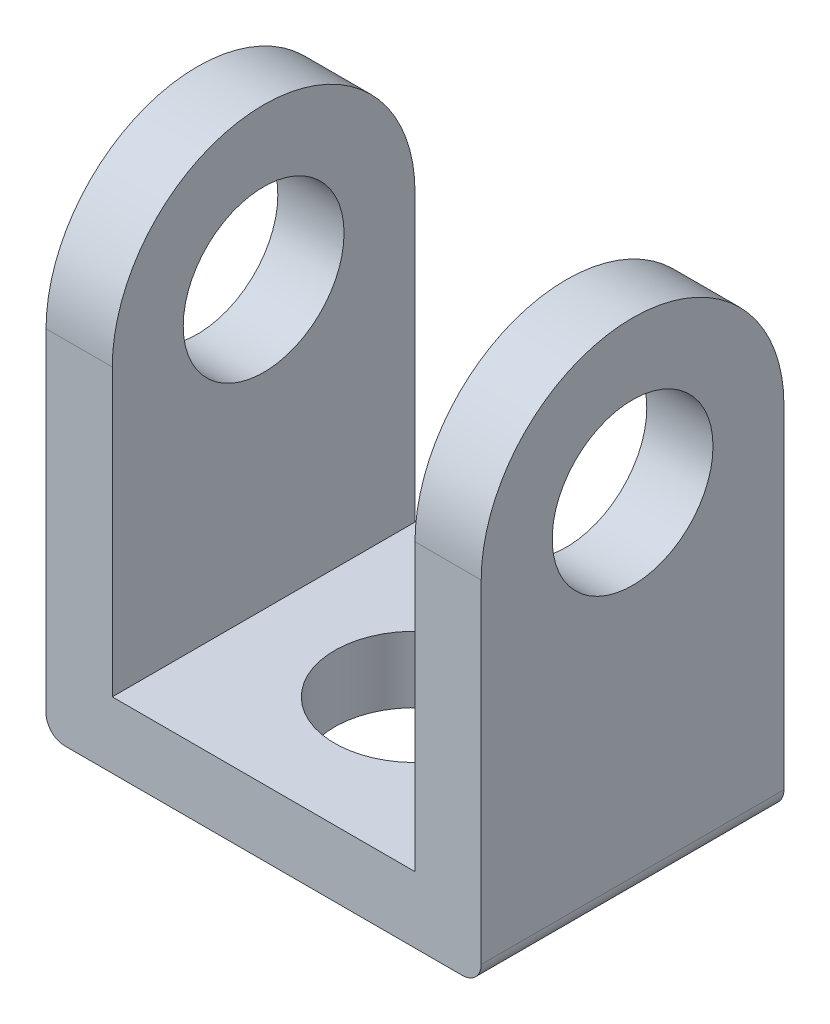
ISO-10303-21;
HEADER;
FILE_DESCRIPTION(('STEP AP214'),'2;1');
FILE_NAME('part.step','',(''),(''),'','','');
FILE_SCHEMA(('AUTOMOTIVE_DESIGN { 1 0 10303 214 1 1 1 1 }'));
ENDSEC;
DATA;
#1=APPLICATION_CONTEXT('core data for automotive mechanical design processes');
#2=APPLICATION_PROTOCOL_DEFINITION('international standard','automotive_design',2000,#1);
#3=PRODUCT_CONTEXT('',#1,'mechanical');
#4=PRODUCT('Part','Part','',(#3));
#5=PRODUCT_RELATED_PRODUCT_CATEGORY('part','',(#4));
#6=PRODUCT_DEFINITION_FORMATION('','',#4);
#7=PRODUCT_DEFINITION_CONTEXT('part definition',#1,'design');
#8=PRODUCT_DEFINITION('design','',#6,#7);
#9=PRODUCT_DEFINITION_SHAPE('','',#8);
#10=(LENGTH_UNIT() NAMED_UNIT(*) SI_UNIT(.MILLI.,.METRE.));
#11=(NAMED_UNIT(*) PLANE_ANGLE_UNIT() SI_UNIT($,.RADIAN.));
#12=(NAMED_UNIT(*) SI_UNIT($,.STERADIAN.) SOLID_ANGLE_UNIT());
#13=UNCERTAINTY_MEASURE_WITH_UNIT(LENGTH_MEASURE(1.E-05),#10,'distance_accuracy_value','');
#14=(GEOMETRIC_REPRESENTATION_CONTEXT(3) GLOBAL_UNCERTAINTY_ASSIGNED_CONTEXT((#13)) GLOBAL_UNIT_ASSIGNED_CONTEXT((#10,
#11,#12)) REPRESENTATION_CONTEXT('',''));
#15=CARTESIAN_POINT('',(0.,0.,0.));
#16=DIRECTION('',(0.,0.,1.));
#17=DIRECTION('',(1.,0.,0.));
#18=AXIS2_PLACEMENT_3D('',#15,#16,#17);
#19=CARTESIAN_POINT('',(-5.751,9.3,0.));
#20=DIRECTION('',(1.,0.,0.));
#21=DIRECTION('',(0.,0.,-1.));
#22=AXIS2_PLACEMENT_3D('',#19,#20,#21);
#23=CYLINDRICAL_SURFACE('',#22,2.125);
#24=CARTESIAN_POINT('',(-4.,9.3,0.));
#25=DIRECTION('',(-1.,0.,0.));
#26=DIRECTION('',(0.,0.,1.));
#27=AXIS2_PLACEMENT_3D('',#24,#25,#26);
#28=CIRCLE('',#27,2.125);
#29=CARTESIAN_POINT('',(-4.,9.3,2.125));
#30=VERTEX_POINT('',#29);
#31=EDGE_CURVE('E165',#30,#30,#28,.T.);
#32=ORIENTED_EDGE('',*,*,#31,.F.);
#33=EDGE_LOOP('',(#32));
#34=FACE_BOUND('',#33,.T.);
#35=CARTESIAN_POINT('',(-5.75,9.3,0.));
#36=DIRECTION('',(1.,0.,0.));
#37=DIRECTION('',(0.,0.,-1.));
#38=AXIS2_PLACEMENT_3D('',#35,#36,#37);
#39=CIRCLE('',#38,2.125);
#40=CARTESIAN_POINT('',(-5.75,9.3,-2.125));
#41=VERTEX_POINT('',#40);
#42=EDGE_CURVE('E182',#41,#41,#39,.F.);
#43=ORIENTED_EDGE('',*,*,#42,.T.);
#44=EDGE_LOOP('',(#43));
#45=FACE_BOUND('',#44,.T.);
#46=ADVANCED_FACE('F51',(#34,#45),#23,.F.);
#47=CARTESIAN_POINT('',(-5.751,9.3,0.));
#48=DIRECTION('',(1.,0.,0.));
#49=DIRECTION('',(0.,0.,-1.));
#50=AXIS2_PLACEMENT_3D('',#47,#48,#49);
#51=CYLINDRICAL_SURFACE('',#50,4.);
#52=CARTESIAN_POINT('',(-4.,9.3,0.));
#53=DIRECTION('',(-1.,0.,0.));
#54=DIRECTION('',(0.,0.,1.));
#55=AXIS2_PLACEMENT_3D('',#52,#53,#54);
#56=CIRCLE('',#55,4.);
#57=CARTESIAN_POINT('',(-4.,9.3,4.));
#58=VERTEX_POINT('',#57);
#59=CARTESIAN_POINT('',(-4.,9.3,-4.));
#60=VERTEX_POINT('',#59);
#61=EDGE_CURVE('E148',#58,#60,#56,.T.);
#62=ORIENTED_EDGE('',*,*,#61,.T.);
#63=DIRECTION('',(1.,0.,0.));
#64=VECTOR('',#63,1.);
#65=CARTESIAN_POINT('',(-5.751,9.3,-4.));
#66=LINE('',#65,#64);
#67=CARTESIAN_POINT('',(-5.75,9.3,-4.));
#68=VERTEX_POINT('',#67);
#69=EDGE_CURVE('E176',#68,#60,#66,.T.);
#70=ORIENTED_EDGE('',*,*,#69,.F.);
#71=CARTESIAN_POINT('',(-5.75,9.3,0.));
#72=DIRECTION('',(1.,0.,0.));
#73=DIRECTION('',(0.,0.,-1.));
#74=AXIS2_PLACEMENT_3D('',#71,#72,#73);
#75=CIRCLE('',#74,4.);
#76=CARTESIAN_POINT('',(-5.75,9.3,4.));
#77=VERTEX_POINT('',#76);
#78=EDGE_CURVE('E168',#77,#68,#75,.F.);
#79=ORIENTED_EDGE('',*,*,#78,.F.);
#80=DIRECTION('',(1.,0.,0.));
#81=VECTOR('',#80,1.);
#82=CARTESIAN_POINT('',(-5.751,9.3,4.));
#83=LINE('',#82,#81);
#84=EDGE_CURVE('E166',#77,#58,#83,.T.);
#85=ORIENTED_EDGE('',*,*,#84,.T.);
#86=EDGE_LOOP('',(#62,#70,#79,#85));
#87=FACE_BOUND('',#86,.T.);
#88=ADVANCED_FACE('F230',(#87),#51,.T.);
#89=CARTESIAN_POINT('',(-5.75,13.3,4.));
#90=DIRECTION('',(1.,0.,0.));
#91=DIRECTION('',(0.,0.,-1.));
#92=AXIS2_PLACEMENT_3D('',#89,#90,#91);
#93=PLANE('',#92);
#94=ORIENTED_EDGE('',*,*,#42,.F.);
#95=EDGE_LOOP('',(#94));
#96=FACE_BOUND('',#95,.T.);
#97=DIRECTION('',(0.,-1.,0.));
#98=VECTOR('',#97,1.);
#99=CARTESIAN_POINT('',(-5.75,13.3,-4.));
#100=LINE('',#99,#98);
#101=CARTESIAN_POINT('',(-5.75,0.5,-4.));
#102=VERTEX_POINT('',#101);
#103=EDGE_CURVE('E190',#68,#102,#100,.T.);
#104=ORIENTED_EDGE('',*,*,#103,.T.);
#105=DIRECTION('',(0.,0.,1.));
#106=VECTOR('',#105,1.);
#107=CARTESIAN_POINT('',(-5.75,0.5,4.));
#108=LINE('',#107,#106);
#109=CARTESIAN_POINT('',(-5.75,0.5,4.));
#110=VERTEX_POINT('',#109);
#111=EDGE_CURVE('E12',#102,#110,#108,.T.);
#112=ORIENTED_EDGE('',*,*,#111,.T.);
#113=DIRECTION('',(0.,-1.,0.));
#114=VECTOR('',#113,1.);
#115=CARTESIAN_POINT('',(-5.75,13.3,4.));
#116=LINE('',#115,#114);
#117=EDGE_CURVE('E199',#77,#110,#116,.T.);
#118=ORIENTED_EDGE('',*,*,#117,.F.);
#119=ORIENTED_EDGE('',*,*,#78,.T.);
#120=EDGE_LOOP('',(#104,#112,#118,#119));
#121=FACE_BOUND('',#120,.T.);
#122=ADVANCED_FACE('F227',(#96,#121),#93,.F.);
#123=CARTESIAN_POINT('',(5.75,13.3,4.));
#124=DIRECTION('',(-1.,0.,0.));
#125=DIRECTION('',(0.,0.,1.));
#126=AXIS2_PLACEMENT_3D('',#123,#124,#125);
#127=PLANE('',#126);
#128=CARTESIAN_POINT('',(5.75,9.3,0.));
#129=DIRECTION('',(1.,0.,0.));
#130=DIRECTION('',(0.,0.,-1.));
#131=AXIS2_PLACEMENT_3D('',#128,#129,#130);
#132=CIRCLE('',#131,2.125);
#133=CARTESIAN_POINT('',(5.75,9.3,-2.125));
#134=VERTEX_POINT('',#133);
#135=EDGE_CURVE('E179',#134,#134,#132,.T.);
#136=ORIENTED_EDGE('',*,*,#135,.F.);
#137=EDGE_LOOP('',(#136));
#138=FACE_BOUND('',#137,.T.);
#139=DIRECTION('',(0.,-1.,0.));
#140=VECTOR('',#139,1.);
#141=CARTESIAN_POINT('',(5.75,13.3,4.));
#142=LINE('',#141,#140);
#143=CARTESIAN_POINT('',(5.75,9.3,4.));
#144=VERTEX_POINT('',#143);
#145=CARTESIAN_POINT('',(5.75,0.5,4.));
#146=VERTEX_POINT('',#145);
#147=EDGE_CURVE('E196',#144,#146,#142,.T.);
#148=ORIENTED_EDGE('',*,*,#147,.T.);
#149=DIRECTION('',(0.,0.,-1.));
#150=VECTOR('',#149,1.);
#151=CARTESIAN_POINT('',(5.75,0.5,-4.));
#152=LINE('',#151,#150);
#153=CARTESIAN_POINT('',(5.75,0.5,-4.));
#154=VERTEX_POINT('',#153);
#155=EDGE_CURVE('E202',#146,#154,#152,.T.);
#156=ORIENTED_EDGE('',*,*,#155,.T.);
#157=DIRECTION('',(0.,-1.,0.));
#158=VECTOR('',#157,1.);
#159=CARTESIAN_POINT('',(5.75,13.3,-4.));
#160=LINE('',#159,#158);
#161=CARTESIAN_POINT('',(5.75,9.3,-4.));
#162=VERTEX_POINT('',#161);
#163=EDGE_CURVE('E193',#162,#154,#160,.T.);
#164=ORIENTED_EDGE('',*,*,#163,.F.);
#165=CARTESIAN_POINT('',(5.75,9.3,0.));
#166=DIRECTION('',(1.,0.,0.));
#167=DIRECTION('',(0.,0.,-1.));
#168=AXIS2_PLACEMENT_3D('',#165,#166,#167);
#169=CIRCLE('',#168,4.);
#170=EDGE_CURVE('E172',#162,#144,#169,.T.);
#171=ORIENTED_EDGE('',*,*,#170,.T.);
#172=EDGE_LOOP('',(#148,#156,#164,#171));
#173=FACE_BOUND('',#172,.T.);
#174=ADVANCED_FACE('F217',(#138,#173),#127,.F.);
#175=CARTESIAN_POINT('',(-5.75,13.3,4.));
#176=DIRECTION('',(0.,0.,-1.));
#177=DIRECTION('',(-1.,0.,0.));
#178=AXIS2_PLACEMENT_3D('',#175,#176,#177);
#179=PLANE('',#178);
#180=DIRECTION('',(1.,0.,0.));
#181=VECTOR('',#180,1.);
#182=CARTESIAN_POINT('',(-5.75,0.,4.));
#183=LINE('',#182,#181);
#184=CARTESIAN_POINT('',(-5.25,0.,4.));
#185=VERTEX_POINT('',#184);
#186=CARTESIAN_POINT('',(5.25,0.,4.));
#187=VERTEX_POINT('',#186);
#188=EDGE_CURVE('E185',#185,#187,#183,.T.);
#189=ORIENTED_EDGE('',*,*,#188,.T.);
#190=CARTESIAN_POINT('',(5.25,0.5,4.));
#191=DIRECTION('',(0.,0.,-1.));
#192=DIRECTION('',(-1.,0.,0.));
#193=AXIS2_PLACEMENT_3D('',#190,#191,#192);
#194=CIRCLE('',#193,0.5);
#195=EDGE_CURVE('E59',#187,#146,#194,.F.);
#196=ORIENTED_EDGE('',*,*,#195,.T.);
#197=ORIENTED_EDGE('',*,*,#147,.F.);
#198=CARTESIAN_POINT('',(4.,9.3,4.));
#199=VERTEX_POINT('',#198);
#200=EDGE_CURVE('E169',#199,#144,#83,.T.);
#201=ORIENTED_EDGE('',*,*,#200,.F.);
#202=DIRECTION('',(0.,1.,0.));
#203=VECTOR('',#202,1.);
#204=CARTESIAN_POINT('',(4.,1.75,4.));
#205=LINE('',#204,#203);
#206=CARTESIAN_POINT('',(4.,1.75,4.));
#207=VERTEX_POINT('',#206);
#208=EDGE_CURVE('E141',#207,#199,#205,.T.);
#209=ORIENTED_EDGE('',*,*,#208,.F.);
#210=DIRECTION('',(1.,0.,0.));
#211=VECTOR('',#210,1.);
#212=CARTESIAN_POINT('',(-4.,1.75,4.));
#213=LINE('',#212,#211);
#214=CARTESIAN_POINT('',(-4.,1.75,4.));
#215=VERTEX_POINT('',#214);
#216=EDGE_CURVE('E134',#215,#207,#213,.T.);
#217=ORIENTED_EDGE('',*,*,#216,.F.);
#218=DIRECTION('',(0.,-1.,0.));
#219=VECTOR('',#218,1.);
#220=CARTESIAN_POINT('',(-4.,13.3,4.));
#221=LINE('',#220,#219);
#222=EDGE_CURVE('E144',#58,#215,#221,.T.);
#223=ORIENTED_EDGE('',*,*,#222,.F.);
#224=ORIENTED_EDGE('',*,*,#84,.F.);
#225=ORIENTED_EDGE('',*,*,#117,.T.);
#226=CARTESIAN_POINT('',(-5.25,0.5,4.));
#227=DIRECTION('',(0.,0.,-1.));
#228=DIRECTION('',(-1.,0.,0.));
#229=AXIS2_PLACEMENT_3D('',#226,#227,#228);
#230=CIRCLE('',#229,0.5);
#231=EDGE_CURVE('E66',#110,#185,#230,.F.);
#232=ORIENTED_EDGE('',*,*,#231,.T.);
#233=EDGE_LOOP('',(#189,#196,#197,#201,#209,#217,#223,#224,#225,#232));
#234=FACE_BOUND('',#233,.T.);
#235=ADVANCED_FACE('F154',(#234),#179,.F.);
#236=CARTESIAN_POINT('',(-5.75,13.3,-4.));
#237=DIRECTION('',(0.,0.,1.));
#238=DIRECTION('',(1.,0.,0.));
#239=AXIS2_PLACEMENT_3D('',#236,#237,#238);
#240=PLANE('',#239);
#241=ORIENTED_EDGE('',*,*,#163,.T.);
#242=CARTESIAN_POINT('',(5.25,0.5,-4.));
#243=DIRECTION('',(0.,0.,1.));
#244=DIRECTION('',(1.,0.,0.));
#245=AXIS2_PLACEMENT_3D('',#242,#243,#244);
#246=CIRCLE('',#245,0.5);
#247=CARTESIAN_POINT('',(5.25,0.,-4.));
#248=VERTEX_POINT('',#247);
#249=EDGE_CURVE('E207',#154,#248,#246,.F.);
#250=ORIENTED_EDGE('',*,*,#249,.T.);
#251=DIRECTION('',(-1.,0.,0.));
#252=VECTOR('',#251,1.);
#253=CARTESIAN_POINT('',(-5.75,0.,-4.));
#254=LINE('',#253,#252);
#255=CARTESIAN_POINT('',(-5.25,0.,-4.));
#256=VERTEX_POINT('',#255);
#257=EDGE_CURVE('E187',#248,#256,#254,.T.);
#258=ORIENTED_EDGE('',*,*,#257,.T.);
#259=CARTESIAN_POINT('',(-5.25,0.5,-4.));
#260=DIRECTION('',(0.,0.,1.));
#261=DIRECTION('',(1.,0.,0.));
#262=AXIS2_PLACEMENT_3D('',#259,#260,#261);
#263=CIRCLE('',#262,0.5);
#264=EDGE_CURVE('E205',#256,#102,#263,.F.);
#265=ORIENTED_EDGE('',*,*,#264,.T.);
#266=ORIENTED_EDGE('',*,*,#103,.F.);
#267=ORIENTED_EDGE('',*,*,#69,.T.);
#268=DIRECTION('',(0.,1.,0.));
#269=VECTOR('',#268,1.);
#270=CARTESIAN_POINT('',(-4.,13.3,-4.));
#271=LINE('',#270,#269);
#272=CARTESIAN_POINT('',(-4.,1.75,-4.));
#273=VERTEX_POINT('',#272);
#274=EDGE_CURVE('E152',#273,#60,#271,.T.);
#275=ORIENTED_EDGE('',*,*,#274,.F.);
#276=DIRECTION('',(-1.,0.,0.));
#277=VECTOR('',#276,1.);
#278=CARTESIAN_POINT('',(-4.,1.75,-4.));
#279=LINE('',#278,#277);
#280=CARTESIAN_POINT('',(4.,1.75,-4.));
#281=VERTEX_POINT('',#280);
#282=EDGE_CURVE('E137',#281,#273,#279,.T.);
#283=ORIENTED_EDGE('',*,*,#282,.F.);
#284=DIRECTION('',(0.,-1.,0.));
#285=VECTOR('',#284,1.);
#286=CARTESIAN_POINT('',(4.,1.75,-4.));
#287=LINE('',#286,#285);
#288=CARTESIAN_POINT('',(4.,9.3,-4.));
#289=VERTEX_POINT('',#288);
#290=EDGE_CURVE('E232',#289,#281,#287,.T.);
#291=ORIENTED_EDGE('',*,*,#290,.F.);
#292=EDGE_CURVE('E175',#289,#162,#66,.T.);
#293=ORIENTED_EDGE('',*,*,#292,.T.);
#294=EDGE_LOOP('',(#241,#250,#258,#265,#266,#267,#275,#283,#291,#293));
#295=FACE_BOUND('',#294,.T.);
#296=ADVANCED_FACE('F222',(#295),#240,.F.);
#297=CARTESIAN_POINT('',(0.,0.,0.));
#298=DIRECTION('',(0.,-1.,0.));
#299=DIRECTION('',(0.,0.,-1.));
#300=AXIS2_PLACEMENT_3D('',#297,#298,#299);
#301=PLANE('',#300);
#302=CARTESIAN_POINT('',(0.,0.,0.));
#303=DIRECTION('',(0.,-1.,0.));
#304=DIRECTION('',(0.,0.,-1.));
#305=AXIS2_PLACEMENT_3D('',#302,#303,#304);
#306=CIRCLE('',#305,2.125);
#307=CARTESIAN_POINT('',(0.,0.,-2.125));
#308=VERTEX_POINT('',#307);
#309=EDGE_CURVE('E248',#308,#308,#306,.T.);
#310=ORIENTED_EDGE('',*,*,#309,.F.);
#311=EDGE_LOOP('',(#310));
#312=FACE_BOUND('',#311,.T.);
#313=ORIENTED_EDGE('',*,*,#257,.F.);
#314=DIRECTION('',(0.,0.,-1.));
#315=VECTOR('',#314,1.);
#316=CARTESIAN_POINT('',(5.25,0.,4.));
#317=LINE('',#316,#315);
#318=EDGE_CURVE('E73',#248,#187,#317,.F.);
#319=ORIENTED_EDGE('',*,*,#318,.T.);
#320=ORIENTED_EDGE('',*,*,#188,.F.);
#321=DIRECTION('',(0.,0.,1.));
#322=VECTOR('',#321,1.);
#323=CARTESIAN_POINT('',(-5.25,0.,-4.));
#324=LINE('',#323,#322);
#325=EDGE_CURVE('E209',#185,#256,#324,.F.);
#326=ORIENTED_EDGE('',*,*,#325,.T.);
#327=EDGE_LOOP('',(#313,#319,#320,#326));
#328=FACE_BOUND('',#327,.T.);
#329=ADVANCED_FACE('F224',(#312,#328),#301,.T.);
#330=CARTESIAN_POINT('',(4.,9.3,0.));
#331=DIRECTION('',(1.,0.,0.));
#332=DIRECTION('',(0.,0.,-1.));
#333=AXIS2_PLACEMENT_3D('',#330,#331,#332);
#334=CIRCLE('',#333,2.125);
#335=CARTESIAN_POINT('',(4.,9.3,-2.125));
#336=VERTEX_POINT('',#335);
#337=EDGE_CURVE('E162',#336,#336,#334,.T.);
#338=ORIENTED_EDGE('',*,*,#337,.F.);
#339=EDGE_LOOP('',(#338));
#340=FACE_BOUND('',#339,.T.);
#341=ORIENTED_EDGE('',*,*,#135,.T.);
#342=EDGE_LOOP('',(#341));
#343=FACE_BOUND('',#342,.T.);
#344=ADVANCED_FACE('F258',(#340,#343),#23,.F.);
#345=CARTESIAN_POINT('',(4.,9.3,0.));
#346=DIRECTION('',(1.,0.,0.));
#347=DIRECTION('',(0.,0.,-1.));
#348=AXIS2_PLACEMENT_3D('',#345,#346,#347);
#349=CIRCLE('',#348,4.);
#350=EDGE_CURVE('E243',#289,#199,#349,.T.);
#351=ORIENTED_EDGE('',*,*,#350,.T.);
#352=ORIENTED_EDGE('',*,*,#200,.T.);
#353=ORIENTED_EDGE('',*,*,#170,.F.);
#354=ORIENTED_EDGE('',*,*,#292,.F.);
#355=EDGE_LOOP('',(#351,#352,#353,#354));
#356=FACE_BOUND('',#355,.T.);
#357=ADVANCED_FACE('F241',(#356),#51,.T.);
#358=CARTESIAN_POINT('',(-4.,13.3,-4.001));
#359=DIRECTION('',(-1.,0.,0.));
#360=DIRECTION('',(0.,0.,1.));
#361=AXIS2_PLACEMENT_3D('',#358,#359,#360);
#362=PLANE('',#361);
#363=ORIENTED_EDGE('',*,*,#274,.T.);
#364=ORIENTED_EDGE('',*,*,#61,.F.);
#365=ORIENTED_EDGE('',*,*,#222,.T.);
#366=DIRECTION('',(0.,0.,1.));
#367=VECTOR('',#366,1.);
#368=CARTESIAN_POINT('',(-4.,1.75,-4.001));
#369=LINE('',#368,#367);
#370=EDGE_CURVE('E130',#273,#215,#369,.T.);
#371=ORIENTED_EDGE('',*,*,#370,.F.);
#372=EDGE_LOOP('',(#363,#364,#365,#371));
#373=FACE_BOUND('',#372,.T.);
#374=ORIENTED_EDGE('',*,*,#31,.T.);
#375=EDGE_LOOP('',(#374));
#376=FACE_BOUND('',#375,.T.);
#377=ADVANCED_FACE('F145',(#373,#376),#362,.F.);
#378=CARTESIAN_POINT('',(4.,1.75,-4.001));
#379=DIRECTION('',(1.,0.,0.));
#380=DIRECTION('',(0.,0.,-1.));
#381=AXIS2_PLACEMENT_3D('',#378,#379,#380);
#382=PLANE('',#381);
#383=ORIENTED_EDGE('',*,*,#290,.T.);
#384=DIRECTION('',(0.,0.,1.));
#385=VECTOR('',#384,1.);
#386=CARTESIAN_POINT('',(4.,1.75,-4.001));
#387=LINE('',#386,#385);
#388=EDGE_CURVE('E140',#281,#207,#387,.T.);
#389=ORIENTED_EDGE('',*,*,#388,.T.);
#390=ORIENTED_EDGE('',*,*,#208,.T.);
#391=ORIENTED_EDGE('',*,*,#350,.F.);
#392=EDGE_LOOP('',(#383,#389,#390,#391));
#393=FACE_BOUND('',#392,.T.);
#394=ORIENTED_EDGE('',*,*,#337,.T.);
#395=EDGE_LOOP('',(#394));
#396=FACE_BOUND('',#395,.T.);
#397=ADVANCED_FACE('F278',(#393,#396),#382,.F.);
#398=CARTESIAN_POINT('',(-4.,1.75,-4.001));
#399=DIRECTION('',(0.,-1.,0.));
#400=DIRECTION('',(0.,0.,-1.));
#401=AXIS2_PLACEMENT_3D('',#398,#399,#400);
#402=PLANE('',#401);
#403=CARTESIAN_POINT('',(0.,1.75,0.));
#404=DIRECTION('',(0.,-1.,0.));
#405=DIRECTION('',(0.,0.,-1.));
#406=AXIS2_PLACEMENT_3D('',#403,#404,#405);
#407=CIRCLE('',#406,2.125);
#408=CARTESIAN_POINT('',(0.,1.75,-2.125));
#409=VERTEX_POINT('',#408);
#410=EDGE_CURVE('E245',#409,#409,#407,.F.);
#411=ORIENTED_EDGE('',*,*,#410,.F.);
#412=EDGE_LOOP('',(#411));
#413=FACE_BOUND('',#412,.T.);
#414=ORIENTED_EDGE('',*,*,#282,.T.);
#415=ORIENTED_EDGE('',*,*,#370,.T.);
#416=ORIENTED_EDGE('',*,*,#216,.T.);
#417=ORIENTED_EDGE('',*,*,#388,.F.);
#418=EDGE_LOOP('',(#414,#415,#416,#417));
#419=FACE_BOUND('',#418,.T.);
#420=ADVANCED_FACE('F132',(#413,#419),#402,.F.);
#421=CARTESIAN_POINT('',(0.,13.301,0.));
#422=DIRECTION('',(0.,-1.,0.));
#423=DIRECTION('',(0.,0.,-1.));
#424=AXIS2_PLACEMENT_3D('',#421,#422,#423);
#425=CYLINDRICAL_SURFACE('',#424,2.125);
#426=ORIENTED_EDGE('',*,*,#309,.T.);
#427=EDGE_LOOP('',(#426));
#428=FACE_BOUND('',#427,.T.);
#429=ORIENTED_EDGE('',*,*,#410,.T.);
#430=EDGE_LOOP('',(#429));
#431=FACE_BOUND('',#430,.T.);
#432=ADVANCED_FACE('F254',(#428,#431),#425,.F.);
#433=CARTESIAN_POINT('',(5.25,0.5,4.));
#434=DIRECTION('',(0.,0.,1.));
#435=DIRECTION('',(1.,0.,0.));
#436=AXIS2_PLACEMENT_3D('',#433,#434,#435);
#437=CYLINDRICAL_SURFACE('',#436,0.5);
#438=ORIENTED_EDGE('',*,*,#195,.F.);
#439=ORIENTED_EDGE('',*,*,#318,.F.);
#440=ORIENTED_EDGE('',*,*,#249,.F.);
#441=ORIENTED_EDGE('',*,*,#155,.F.);
#442=EDGE_LOOP('',(#438,#439,#440,#441));
#443=FACE_BOUND('',#442,.T.);
#444=ADVANCED_FACE('F220',(#443),#437,.T.);
#445=CARTESIAN_POINT('',(-5.25,0.5,4.));
#446=DIRECTION('',(0.,0.,-1.));
#447=DIRECTION('',(-1.,0.,0.));
#448=AXIS2_PLACEMENT_3D('',#445,#446,#447);
#449=CYLINDRICAL_SURFACE('',#448,0.5);
#450=ORIENTED_EDGE('',*,*,#264,.F.);
#451=ORIENTED_EDGE('',*,*,#325,.F.);
#452=ORIENTED_EDGE('',*,*,#231,.F.);
#453=ORIENTED_EDGE('',*,*,#111,.F.);
#454=EDGE_LOOP('',(#450,#451,#452,#453));
#455=FACE_BOUND('',#454,.T.);
#456=ADVANCED_FACE('F53',(#455),#449,.T.);
#457=CLOSED_SHELL('',(#46,#88,#122,#174,#235,#296,#329,#344,#357,#377,#397,#420,#432,#444,#456));
#458=MANIFOLD_SOLID_BREP('B2',#457);
#459=ADVANCED_BREP_SHAPE_REPRESENTATION('',(#18,#458),#14);
#460=SHAPE_DEFINITION_REPRESENTATION(#9,#459);
ENDSEC;
END-ISO-10303-21;
